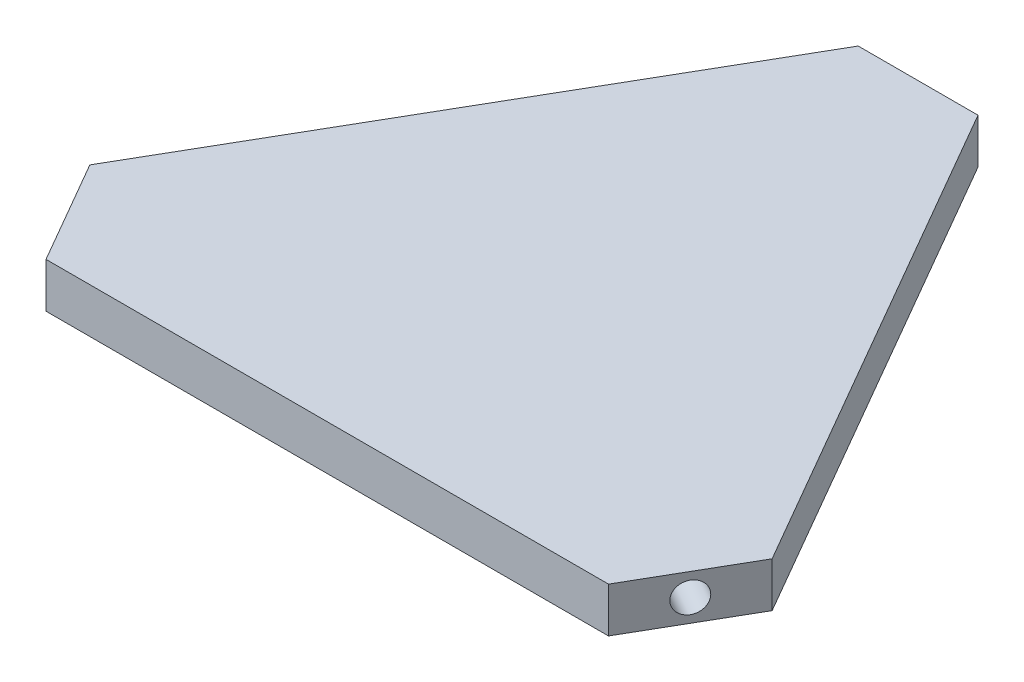
ISO-10303-21;
HEADER;
FILE_DESCRIPTION(('STEP AP214'),'2;1');
FILE_NAME('part.step','',(''),(''),'','','');
FILE_SCHEMA(('AUTOMOTIVE_DESIGN { 1 0 10303 214 1 1 1 1 }'));
ENDSEC;
DATA;
#1=APPLICATION_CONTEXT('core data for automotive mechanical design processes');
#2=APPLICATION_PROTOCOL_DEFINITION('international standard','automotive_design',2000,#1);
#3=PRODUCT_CONTEXT('',#1,'mechanical');
#4=PRODUCT('Part','Part','',(#3));
#5=PRODUCT_RELATED_PRODUCT_CATEGORY('part','',(#4));
#6=PRODUCT_DEFINITION_FORMATION('','',#4);
#7=PRODUCT_DEFINITION_CONTEXT('part definition',#1,'design');
#8=PRODUCT_DEFINITION('design','',#6,#7);
#9=PRODUCT_DEFINITION_SHAPE('','',#8);
#10=(LENGTH_UNIT() NAMED_UNIT(*) SI_UNIT(.MILLI.,.METRE.));
#11=(NAMED_UNIT(*) PLANE_ANGLE_UNIT() SI_UNIT($,.RADIAN.));
#12=(NAMED_UNIT(*) SI_UNIT($,.STERADIAN.) SOLID_ANGLE_UNIT());
#13=UNCERTAINTY_MEASURE_WITH_UNIT(LENGTH_MEASURE(1.E-05),#10,'distance_accuracy_value','');
#14=(GEOMETRIC_REPRESENTATION_CONTEXT(3) GLOBAL_UNCERTAINTY_ASSIGNED_CONTEXT((#13)) GLOBAL_UNIT_ASSIGNED_CONTEXT((#10,
#11,#12)) REPRESENTATION_CONTEXT('',''));
#15=CARTESIAN_POINT('',(0.,0.,0.));
#16=DIRECTION('',(0.,0.,1.));
#17=DIRECTION('',(1.,0.,0.));
#18=AXIS2_PLACEMENT_3D('',#15,#16,#17);
#19=CARTESIAN_POINT('',(72.3411357683743,4.7625,27.1014773719377));
#20=DIRECTION('',(-0.866025403784439,0.,0.5));
#21=DIRECTION('',(0.5,0.,0.866025403784439));
#22=AXIS2_PLACEMENT_3D('',#19,#20,#21);
#23=PLANE('',#22);
#24=DIRECTION('',(-0.5,0.,-0.866025403784439));
#25=VECTOR('',#24,1.);
#26=CARTESIAN_POINT('',(72.3411357683743,-4.7625,27.1014773719377));
#27=LINE('',#26,#25);
#28=CARTESIAN_POINT('',(72.3411357683743,-4.7625,27.1014773719377));
#29=VERTEX_POINT('',#28);
#30=CARTESIAN_POINT('',(12.7,-4.7625,-76.2));
#31=VERTEX_POINT('',#30);
#32=EDGE_CURVE('E122',#29,#31,#27,.T.);
#33=ORIENTED_EDGE('',*,*,#32,.T.);
#34=DIRECTION('',(0.,-1.,0.));
#35=VECTOR('',#34,1.);
#36=CARTESIAN_POINT('',(12.7,4.7625,-76.2));
#37=LINE('',#36,#35);
#38=CARTESIAN_POINT('',(12.7,4.7625,-76.2));
#39=VERTEX_POINT('',#38);
#40=EDGE_CURVE('E11',#39,#31,#37,.T.);
#41=ORIENTED_EDGE('',*,*,#40,.F.);
#42=DIRECTION('',(-0.5,0.,-0.866025403784439));
#43=VECTOR('',#42,1.);
#44=CARTESIAN_POINT('',(72.3411357683743,4.7625,27.1014773719377));
#45=LINE('',#44,#43);
#46=CARTESIAN_POINT('',(72.3411357683743,4.7625,27.1014773719377));
#47=VERTEX_POINT('',#46);
#48=EDGE_CURVE('E133',#47,#39,#45,.T.);
#49=ORIENTED_EDGE('',*,*,#48,.F.);
#50=DIRECTION('',(0.,-1.,0.));
#51=VECTOR('',#50,1.);
#52=CARTESIAN_POINT('',(72.3411357683743,4.7625,27.1014773719377));
#53=LINE('',#52,#51);
#54=EDGE_CURVE('E118',#47,#29,#53,.T.);
#55=ORIENTED_EDGE('',*,*,#54,.T.);
#56=EDGE_LOOP('',(#33,#41,#49,#55));
#57=FACE_BOUND('',#56,.T.);
#58=ADVANCED_FACE('F35',(#57),#23,.F.);
#59=CARTESIAN_POINT('',(12.7,4.7625,-76.2));
#60=DIRECTION('',(0.,0.,1.));
#61=DIRECTION('',(1.,0.,0.));
#62=AXIS2_PLACEMENT_3D('',#59,#60,#61);
#63=PLANE('',#62);
#64=CARTESIAN_POINT('',(-2.70616862252382E-13,0.,-76.2000000000001));
#65=DIRECTION('',(0.,0.,-1.));
#66=DIRECTION('',(-1.,0.,0.));
#67=AXIS2_PLACEMENT_3D('',#64,#65,#66);
#68=CIRCLE('',#67,3.17499999999999);
#69=CARTESIAN_POINT('',(-3.17500000000026,0.,-76.2000000000001));
#70=VERTEX_POINT('',#69);
#71=EDGE_CURVE('E181',#70,#70,#68,.T.);
#72=ORIENTED_EDGE('',*,*,#71,.F.);
#73=EDGE_LOOP('',(#72));
#74=FACE_BOUND('',#73,.T.);
#75=DIRECTION('',(-1.,0.,0.));
#76=VECTOR('',#75,1.);
#77=CARTESIAN_POINT('',(12.7,-4.7625,-76.2));
#78=LINE('',#77,#76);
#79=CARTESIAN_POINT('',(-12.7,-4.7625,-76.2));
#80=VERTEX_POINT('',#79);
#81=EDGE_CURVE('E125',#31,#80,#78,.T.);
#82=ORIENTED_EDGE('',*,*,#81,.T.);
#83=DIRECTION('',(0.,-1.,0.));
#84=VECTOR('',#83,1.);
#85=CARTESIAN_POINT('',(-12.7,4.7625,-76.2));
#86=LINE('',#85,#84);
#87=CARTESIAN_POINT('',(-12.7,4.7625,-76.2));
#88=VERTEX_POINT('',#87);
#89=EDGE_CURVE('E43',#88,#80,#86,.T.);
#90=ORIENTED_EDGE('',*,*,#89,.F.);
#91=DIRECTION('',(-1.,0.,0.));
#92=VECTOR('',#91,1.);
#93=CARTESIAN_POINT('',(12.7,4.7625,-76.2));
#94=LINE('',#93,#92);
#95=EDGE_CURVE('E89',#39,#88,#94,.T.);
#96=ORIENTED_EDGE('',*,*,#95,.F.);
#97=ORIENTED_EDGE('',*,*,#40,.T.);
#98=EDGE_LOOP('',(#82,#90,#96,#97));
#99=FACE_BOUND('',#98,.T.);
#100=ADVANCED_FACE('F159',(#74,#99),#63,.F.);
#101=CARTESIAN_POINT('',(-12.7,4.7625,-76.2));
#102=DIRECTION('',(0.866025403784439,0.,0.5));
#103=DIRECTION('',(0.5,0.,-0.866025403784439));
#104=AXIS2_PLACEMENT_3D('',#101,#102,#103);
#105=PLANE('',#104);
#106=DIRECTION('',(-0.5,0.,0.866025403784439));
#107=VECTOR('',#106,1.);
#108=CARTESIAN_POINT('',(-12.7,-4.7625,-76.2));
#109=LINE('',#108,#107);
#110=CARTESIAN_POINT('',(-72.3411357683742,-4.7625,27.1014773719376));
#111=VERTEX_POINT('',#110);
#112=EDGE_CURVE('E128',#80,#111,#109,.T.);
#113=ORIENTED_EDGE('',*,*,#112,.T.);
#114=DIRECTION('',(0.,-1.,0.));
#115=VECTOR('',#114,1.);
#116=CARTESIAN_POINT('',(-72.3411357683742,4.7625,27.1014773719376));
#117=LINE('',#116,#115);
#118=CARTESIAN_POINT('',(-72.3411357683742,4.7625,27.1014773719376));
#119=VERTEX_POINT('',#118);
#120=EDGE_CURVE('E113',#119,#111,#117,.T.);
#121=ORIENTED_EDGE('',*,*,#120,.F.);
#122=DIRECTION('',(-0.5,0.,0.866025403784439));
#123=VECTOR('',#122,1.);
#124=CARTESIAN_POINT('',(-12.7,4.7625,-76.2));
#125=LINE('',#124,#123);
#126=EDGE_CURVE('E104',#88,#119,#125,.T.);
#127=ORIENTED_EDGE('',*,*,#126,.F.);
#128=ORIENTED_EDGE('',*,*,#89,.T.);
#129=EDGE_LOOP('',(#113,#121,#127,#128));
#130=FACE_BOUND('',#129,.T.);
#131=ADVANCED_FACE('F139',(#130),#105,.F.);
#132=CARTESIAN_POINT('',(-72.3411357683742,4.7625,27.1014773719376));
#133=DIRECTION('',(0.866025403784438,0.,-0.5));
#134=DIRECTION('',(-0.5,0.,-0.866025403784438));
#135=AXIS2_PLACEMENT_3D('',#132,#133,#134);
#136=PLANE('',#135);
#137=CARTESIAN_POINT('',(-65.991135768374,0.,38.1000000000006));
#138=DIRECTION('',(-0.866025403784434,0.,0.500000000000007));
#139=DIRECTION('',(0.500000000000007,0.,0.866025403784435));
#140=AXIS2_PLACEMENT_3D('',#137,#138,#139);
#141=CIRCLE('',#140,3.17499999999999);
#142=CARTESIAN_POINT('',(-64.403635768374,0.,40.8496306570162));
#143=VERTEX_POINT('',#142);
#144=EDGE_CURVE('E176',#143,#143,#141,.T.);
#145=ORIENTED_EDGE('',*,*,#144,.F.);
#146=EDGE_LOOP('',(#145));
#147=FACE_BOUND('',#146,.T.);
#148=DIRECTION('',(0.5,0.,0.866025403784438));
#149=VECTOR('',#148,1.);
#150=CARTESIAN_POINT('',(-72.3411357683742,-4.7625,27.1014773719376));
#151=LINE('',#150,#149);
#152=CARTESIAN_POINT('',(-59.6411357683742,-4.7625,49.0985226280624));
#153=VERTEX_POINT('',#152);
#154=EDGE_CURVE('E112',#111,#153,#151,.T.);
#155=ORIENTED_EDGE('',*,*,#154,.T.);
#156=DIRECTION('',(0.,-1.,0.));
#157=VECTOR('',#156,1.);
#158=CARTESIAN_POINT('',(-59.6411357683742,4.7625,49.0985226280624));
#159=LINE('',#158,#157);
#160=CARTESIAN_POINT('',(-59.6411357683742,4.7625,49.0985226280624));
#161=VERTEX_POINT('',#160);
#162=EDGE_CURVE('E109',#161,#153,#159,.T.);
#163=ORIENTED_EDGE('',*,*,#162,.F.);
#164=DIRECTION('',(0.5,0.,0.866025403784438));
#165=VECTOR('',#164,1.);
#166=CARTESIAN_POINT('',(-72.3411357683742,4.7625,27.1014773719376));
#167=LINE('',#166,#165);
#168=EDGE_CURVE('E98',#119,#161,#167,.T.);
#169=ORIENTED_EDGE('',*,*,#168,.F.);
#170=ORIENTED_EDGE('',*,*,#120,.T.);
#171=EDGE_LOOP('',(#155,#163,#169,#170));
#172=FACE_BOUND('',#171,.T.);
#173=ADVANCED_FACE('F110',(#147,#172),#136,.F.);
#174=CARTESIAN_POINT('',(-59.6411357683742,4.7625,49.0985226280624));
#175=DIRECTION('',(0.,0.,-1.));
#176=DIRECTION('',(-1.,0.,0.));
#177=AXIS2_PLACEMENT_3D('',#174,#175,#176);
#178=PLANE('',#177);
#179=DIRECTION('',(1.,0.,0.));
#180=VECTOR('',#179,1.);
#181=CARTESIAN_POINT('',(-59.6411357683742,-4.7625,49.0985226280624));
#182=LINE('',#181,#180);
#183=CARTESIAN_POINT('',(59.6411357683742,-4.7625,49.0985226280624));
#184=VERTEX_POINT('',#183);
#185=EDGE_CURVE('E75',#153,#184,#182,.T.);
#186=ORIENTED_EDGE('',*,*,#185,.T.);
#187=DIRECTION('',(0.,-1.,0.));
#188=VECTOR('',#187,1.);
#189=CARTESIAN_POINT('',(59.6411357683742,4.7625,49.0985226280624));
#190=LINE('',#189,#188);
#191=CARTESIAN_POINT('',(59.6411357683742,4.7625,49.0985226280624));
#192=VERTEX_POINT('',#191);
#193=EDGE_CURVE('E114',#192,#184,#190,.T.);
#194=ORIENTED_EDGE('',*,*,#193,.F.);
#195=DIRECTION('',(1.,0.,0.));
#196=VECTOR('',#195,1.);
#197=CARTESIAN_POINT('',(-59.6411357683742,4.7625,49.0985226280624));
#198=LINE('',#197,#196);
#199=EDGE_CURVE('E102',#161,#192,#198,.T.);
#200=ORIENTED_EDGE('',*,*,#199,.F.);
#201=ORIENTED_EDGE('',*,*,#162,.T.);
#202=EDGE_LOOP('',(#186,#194,#200,#201));
#203=FACE_BOUND('',#202,.T.);
#204=ADVANCED_FACE('F116',(#203),#178,.F.);
#205=CARTESIAN_POINT('',(72.3411357683743,4.7625,27.1014773719377));
#206=DIRECTION('',(-0.866025403784438,0.,-0.500000000000001));
#207=DIRECTION('',(-0.500000000000001,0.,0.866025403784438));
#208=AXIS2_PLACEMENT_3D('',#205,#206,#207);
#209=PLANE('',#208);
#210=CARTESIAN_POINT('',(65.9911357683743,0.,38.1000000000001));
#211=DIRECTION('',(0.866025403784438,0.,0.500000000000001));
#212=DIRECTION('',(0.500000000000001,0.,-0.866025403784438));
#213=AXIS2_PLACEMENT_3D('',#210,#211,#212);
#214=CIRCLE('',#213,3.17499999999999);
#215=CARTESIAN_POINT('',(67.5786357683743,0.,35.3503693429845));
#216=VERTEX_POINT('',#215);
#217=EDGE_CURVE('E189',#216,#216,#214,.T.);
#218=ORIENTED_EDGE('',*,*,#217,.F.);
#219=EDGE_LOOP('',(#218));
#220=FACE_BOUND('',#219,.T.);
#221=DIRECTION('',(0.500000000000001,0.,-0.866025403784438));
#222=VECTOR('',#221,1.);
#223=CARTESIAN_POINT('',(72.3411357683743,-4.7625,27.1014773719377));
#224=LINE('',#223,#222);
#225=EDGE_CURVE('E81',#184,#29,#224,.T.);
#226=ORIENTED_EDGE('',*,*,#225,.T.);
#227=ORIENTED_EDGE('',*,*,#54,.F.);
#228=DIRECTION('',(0.500000000000001,0.,-0.866025403784438));
#229=VECTOR('',#228,1.);
#230=CARTESIAN_POINT('',(72.3411357683743,4.7625,27.1014773719377));
#231=LINE('',#230,#229);
#232=EDGE_CURVE('E51',#192,#47,#231,.T.);
#233=ORIENTED_EDGE('',*,*,#232,.F.);
#234=ORIENTED_EDGE('',*,*,#193,.T.);
#235=EDGE_LOOP('',(#226,#227,#233,#234));
#236=FACE_BOUND('',#235,.T.);
#237=ADVANCED_FACE('F146',(#220,#236),#209,.F.);
#238=CARTESIAN_POINT('',(0.,4.7625,0.));
#239=DIRECTION('',(0.,1.,0.));
#240=DIRECTION('',(0.,0.,1.));
#241=AXIS2_PLACEMENT_3D('',#238,#239,#240);
#242=PLANE('',#241);
#243=ORIENTED_EDGE('',*,*,#48,.T.);
#244=ORIENTED_EDGE('',*,*,#95,.T.);
#245=ORIENTED_EDGE('',*,*,#126,.T.);
#246=ORIENTED_EDGE('',*,*,#168,.T.);
#247=ORIENTED_EDGE('',*,*,#199,.T.);
#248=ORIENTED_EDGE('',*,*,#232,.T.);
#249=EDGE_LOOP('',(#243,#244,#245,#246,#247,#248));
#250=FACE_BOUND('',#249,.T.);
#251=ADVANCED_FACE('F100',(#250),#242,.T.);
#252=CARTESIAN_POINT('',(0.,-4.7625,0.));
#253=DIRECTION('',(0.,1.,0.));
#254=DIRECTION('',(0.,0.,1.));
#255=AXIS2_PLACEMENT_3D('',#252,#253,#254);
#256=PLANE('',#255);
#257=ORIENTED_EDGE('',*,*,#32,.F.);
#258=ORIENTED_EDGE('',*,*,#225,.F.);
#259=ORIENTED_EDGE('',*,*,#185,.F.);
#260=ORIENTED_EDGE('',*,*,#154,.F.);
#261=ORIENTED_EDGE('',*,*,#112,.F.);
#262=ORIENTED_EDGE('',*,*,#81,.F.);
#263=EDGE_LOOP('',(#257,#258,#259,#260,#261,#262));
#264=FACE_BOUND('',#263,.T.);
#265=ADVANCED_FACE('F142',(#264),#256,.F.);
#266=CARTESIAN_POINT('',(54.9926131403119,0.,31.7500000000001));
#267=DIRECTION('',(0.866025403784438,0.,0.500000000000001));
#268=DIRECTION('',(0.500000000000001,0.,-0.866025403784438));
#269=AXIS2_PLACEMENT_3D('',#266,#267,#268);
#270=CONICAL_SURFACE('',#269,3.17499999999999,1.02974425867665);
#271=CARTESIAN_POINT('',(53.3404683616404,0.,30.7961337672938));
#272=VERTEX_POINT('',#271);
#273=VERTEX_LOOP('',#272);
#274=FACE_BOUND('',#273,.T.);
#275=CARTESIAN_POINT('',(54.9926131403119,0.,31.7500000000001));
#276=DIRECTION('',(0.866025403784438,0.,0.500000000000001));
#277=DIRECTION('',(0.500000000000001,0.,-0.866025403784438));
#278=AXIS2_PLACEMENT_3D('',#275,#276,#277);
#279=CIRCLE('',#278,3.17499999999999);
#280=CARTESIAN_POINT('',(56.5801131403119,0.,29.0003693429845));
#281=VERTEX_POINT('',#280);
#282=EDGE_CURVE('E126',#281,#281,#279,.T.);
#283=ORIENTED_EDGE('',*,*,#282,.T.);
#284=EDGE_LOOP('',(#283));
#285=FACE_BOUND('',#284,.T.);
#286=ADVANCED_FACE('F197',(#274,#285),#270,.F.);
#287=CARTESIAN_POINT('',(65.9911357683743,0.,38.1000000000001));
#288=DIRECTION('',(0.866025403784438,0.,0.500000000000001));
#289=DIRECTION('',(0.500000000000001,0.,-0.866025403784438));
#290=AXIS2_PLACEMENT_3D('',#287,#288,#289);
#291=CYLINDRICAL_SURFACE('',#290,3.17499999999999);
#292=CARTESIAN_POINT('',(56.5801131403119,0.,29.0003693429845));
#293=CARTESIAN_POINT('',(56.6946810843542,0.,29.0665151763178));
#294=CARTESIAN_POINT('',(56.8092490283965,0.,29.1326610096512));
#295=CARTESIAN_POINT('',(57.0383849164811,0.,29.2649526763179));
#296=CARTESIAN_POINT('',(57.1529528605235,0.,29.3310985096512));
#297=CARTESIAN_POINT('',(57.3820887486081,0.,29.4633901763179));
#298=CARTESIAN_POINT('',(57.4966566926504,0.,29.5295360096512));
#299=CARTESIAN_POINT('',(57.725792580735,0.,29.6618276763179));
#300=CARTESIAN_POINT('',(57.8403605247774,0.,29.7279735096512));
#301=CARTESIAN_POINT('',(58.069496412862,0.,29.8602651763179));
#302=CARTESIAN_POINT('',(58.1840643569043,0.,29.9264110096512));
#303=CARTESIAN_POINT('',(58.4132002449889,0.,30.0587026763179));
#304=CARTESIAN_POINT('',(58.5277681890313,0.,30.1248485096512));
#305=CARTESIAN_POINT('',(58.7569040771159,0.,30.2571401763179));
#306=CARTESIAN_POINT('',(58.8714720211582,0.,30.3232860096512));
#307=CARTESIAN_POINT('',(59.1006079092428,0.,30.4555776763179));
#308=CARTESIAN_POINT('',(59.2151758532852,0.,30.5217235096512));
#309=CARTESIAN_POINT('',(59.4443117413698,0.,30.6540151763179));
#310=CARTESIAN_POINT('',(59.5588796854121,0.,30.7201610096512));
#311=CARTESIAN_POINT('',(59.7880155734967,0.,30.8524526763179));
#312=CARTESIAN_POINT('',(59.9025835175391,0.,30.9185985096512));
#313=CARTESIAN_POINT('',(60.1317194056237,0.,31.0508901763179));
#314=CARTESIAN_POINT('',(60.246287349666,0.,31.1170360096512));
#315=CARTESIAN_POINT('',(60.4754232377506,0.,31.2493276763179));
#316=CARTESIAN_POINT('',(60.589991181793,0.,31.3154735096512));
#317=CARTESIAN_POINT('',(60.8191270698776,0.,31.4477651763179));
#318=CARTESIAN_POINT('',(60.9336950139199,0.,31.5139110096512));
#319=CARTESIAN_POINT('',(61.1628309020045,0.,31.6462026763179));
#320=CARTESIAN_POINT('',(61.2773988460469,0.,31.7123485096512));
#321=CARTESIAN_POINT('',(61.5065347341315,0.,31.8446401763178));
#322=CARTESIAN_POINT('',(61.6211026781738,0.,31.9107860096512));
#323=CARTESIAN_POINT('',(61.8502385662584,0.,32.0430776763179));
#324=CARTESIAN_POINT('',(61.9648065103008,0.,32.1092235096512));
#325=CARTESIAN_POINT('',(62.1939423983854,0.,32.2415151763179));
#326=CARTESIAN_POINT('',(62.3085103424277,0.,32.3076610096512));
#327=CARTESIAN_POINT('',(62.5376462305123,0.,32.4399526763179));
#328=CARTESIAN_POINT('',(62.6522141745547,0.,32.5060985096512));
#329=CARTESIAN_POINT('',(62.8813500626393,0.,32.6383901763179));
#330=CARTESIAN_POINT('',(62.9959180066816,0.,32.7045360096512));
#331=CARTESIAN_POINT('',(63.2250538947662,0.,32.8368276763179));
#332=CARTESIAN_POINT('',(63.3396218388085,0.,32.9029735096512));
#333=CARTESIAN_POINT('',(63.5687577268932,0.,33.0352651763179));
#334=CARTESIAN_POINT('',(63.6833256709355,0.,33.1014110096512));
#335=CARTESIAN_POINT('',(63.9124615590201,0.,33.2337026763179));
#336=CARTESIAN_POINT('',(64.0270295030625,0.,33.2998485096512));
#337=CARTESIAN_POINT('',(64.2561653911471,0.,33.4321401763179));
#338=CARTESIAN_POINT('',(64.3707333351894,0.,33.4982860096512));
#339=CARTESIAN_POINT('',(64.599869223274,0.,33.6305776763179));
#340=CARTESIAN_POINT('',(64.7144371673164,0.,33.6967235096512));
#341=CARTESIAN_POINT('',(64.943573055401,0.,33.8290151763179));
#342=CARTESIAN_POINT('',(65.0581409994433,0.,33.8951610096512));
#343=CARTESIAN_POINT('',(65.2872768875279,0.,34.0274526763179));
#344=CARTESIAN_POINT('',(65.4018448315703,0.,34.0935985096512));
#345=CARTESIAN_POINT('',(65.6309807196549,0.,34.2258901763179));
#346=CARTESIAN_POINT('',(65.7455486636972,0.,34.2920360096512));
#347=CARTESIAN_POINT('',(65.9746845517818,0.,34.4243276763179));
#348=CARTESIAN_POINT('',(66.0892524958241,0.,34.4904735096512));
#349=CARTESIAN_POINT('',(66.3183883839088,0.,34.6227651763179));
#350=CARTESIAN_POINT('',(66.4329563279511,0.,34.6889110096512));
#351=CARTESIAN_POINT('',(66.6620922160357,0.,34.8212026763179));
#352=CARTESIAN_POINT('',(66.7766601600781,0.,34.8873485096512));
#353=CARTESIAN_POINT('',(67.0057960481627,0.,35.0196401763179));
#354=CARTESIAN_POINT('',(67.120363992205,0.,35.0857860096512));
#355=CARTESIAN_POINT('',(67.3494998802896,0.,35.2180776763179));
#356=CARTESIAN_POINT('',(67.4640678243319,0.,35.2842235096512));
#357=CARTESIAN_POINT('',(67.5786357683743,0.,35.3503693429845));
#358=B_SPLINE_CURVE_WITH_KNOTS('',3,(#292,#293,#294,#295,#296,#297,#298,#299,#300,#301,#302,
#303,#304,#305,#306,#307,#308,#309,#310,#311,#312,#313,#314,#315,#316,#317,#318,#319,#320,#321,
#322,#323,#324,#325,#326,#327,#328,#329,#330,#331,#332,#333,#334,#335,#336,#337,#338,#339,#340,
#341,#342,#343,#344,#345,#346,#347,#348,#349,#350,#351,#352,#353,#354,#355,#356,#357),
.UNSPECIFIED.,.F.,.F.,(4,2,2,2,2,2,2,2,2,2,2,2,2,2,2,2,2,2,2,2,2,2,2,2,2,2,2,2,2,2,2,2,4),(0.,
0.396874999999995,0.793749999999999,1.19062499999999,1.5875,1.984375,2.38125,2.778125,3.175,
3.571875,3.96875,4.365625,4.7625,5.159375,5.55625,5.953125,6.35,6.746875,7.14375000000001,
7.540625,7.9375,8.334375,8.73125,9.128125,9.52500000000001,9.92187500000001,10.31875,10.715625,
11.1125,11.509375,11.90625,12.303125,12.7),.UNSPECIFIED.);
#359=EDGE_CURVE('BSEAM199',#281,#216,#358,.T.);
#360=ORIENTED_EDGE('',*,*,#282,.F.);
#361=ORIENTED_EDGE('',*,*,#217,.T.);
#362=ORIENTED_EDGE('',*,*,#359,.T.);
#363=ORIENTED_EDGE('',*,*,#359,.F.);
#364=EDGE_LOOP('',(#360,#362,#361,#363));
#365=FACE_BOUND('',#364,.T.);
#366=ADVANCED_FACE('F199',(#365),#291,.F.);
#367=CARTESIAN_POINT('',(-2.70616862252382E-13,0.,-63.5000000000001));
#368=DIRECTION('',(0.,0.,-1.));
#369=DIRECTION('',(-1.,0.,0.));
#370=AXIS2_PLACEMENT_3D('',#367,#368,#369);
#371=CONICAL_SURFACE('',#370,3.17499999999999,1.02974425867665);
#372=CARTESIAN_POINT('',(-2.75481445719414E-13,0.,-61.5922675345876));
#373=VERTEX_POINT('',#372);
#374=VERTEX_LOOP('',#373);
#375=FACE_BOUND('',#374,.T.);
#376=CARTESIAN_POINT('',(-2.70616862252382E-13,0.,-63.5000000000001));
#377=DIRECTION('',(0.,0.,-1.));
#378=DIRECTION('',(-1.,0.,0.));
#379=AXIS2_PLACEMENT_3D('',#376,#377,#378);
#380=CIRCLE('',#379,3.17499999999999);
#381=CARTESIAN_POINT('',(-3.17500000000026,0.,-63.5000000000001));
#382=VERTEX_POINT('',#381);
#383=EDGE_CURVE('E186',#382,#382,#380,.T.);
#384=ORIENTED_EDGE('',*,*,#383,.T.);
#385=EDGE_LOOP('',(#384));
#386=FACE_BOUND('',#385,.T.);
#387=ADVANCED_FACE('F202',(#375,#386),#371,.F.);
#388=CARTESIAN_POINT('',(-2.70616862252382E-13,0.,-76.2000000000001));
#389=DIRECTION('',(0.,0.,-1.));
#390=DIRECTION('',(-1.,0.,0.));
#391=AXIS2_PLACEMENT_3D('',#388,#389,#390);
#392=CYLINDRICAL_SURFACE('',#391,3.17499999999999);
#393=ORIENTED_EDGE('',*,*,#383,.F.);
#394=EDGE_LOOP('',(#393));
#395=FACE_BOUND('',#394,.T.);
#396=ORIENTED_EDGE('',*,*,#71,.T.);
#397=EDGE_LOOP('',(#396));
#398=FACE_BOUND('',#397,.T.);
#399=ADVANCED_FACE('F208',(#395,#398),#392,.F.);
#400=CARTESIAN_POINT('',(-54.9926131403117,0.,31.7500000000005));
#401=DIRECTION('',(-0.866025403784434,0.,0.500000000000007));
#402=DIRECTION('',(0.500000000000007,0.,0.866025403784435));
#403=AXIS2_PLACEMENT_3D('',#400,#401,#402);
#404=CONICAL_SURFACE('',#403,3.17499999999999,1.02974425867665);
#405=CARTESIAN_POINT('',(-53.3404683616401,0.,30.7961337672942));
#406=VERTEX_POINT('',#405);
#407=VERTEX_LOOP('',#406);
#408=FACE_BOUND('',#407,.T.);
#409=CARTESIAN_POINT('',(-54.9926131403117,0.,31.7500000000005));
#410=DIRECTION('',(-0.866025403784434,0.,0.500000000000007));
#411=DIRECTION('',(0.500000000000007,0.,0.866025403784435));
#412=AXIS2_PLACEMENT_3D('',#409,#410,#411);
#413=CIRCLE('',#412,3.17499999999999);
#414=CARTESIAN_POINT('',(-53.4051131403116,0.,34.4996306570161));
#415=VERTEX_POINT('',#414);
#416=EDGE_CURVE('E178',#415,#415,#413,.T.);
#417=ORIENTED_EDGE('',*,*,#416,.T.);
#418=EDGE_LOOP('',(#417));
#419=FACE_BOUND('',#418,.T.);
#420=ADVANCED_FACE('F255',(#408,#419),#404,.F.);
#421=CARTESIAN_POINT('',(-65.991135768374,0.,38.1000000000006));
#422=DIRECTION('',(-0.866025403784434,0.,0.500000000000007));
#423=DIRECTION('',(0.500000000000007,0.,0.866025403784435));
#424=AXIS2_PLACEMENT_3D('',#421,#422,#423);
#425=CYLINDRICAL_SURFACE('',#424,3.17499999999999);
#426=CARTESIAN_POINT('',(-53.4051131403116,0.,34.4996306570161));
#427=CARTESIAN_POINT('',(-53.519681084354,0.,34.5657764903494));
#428=CARTESIAN_POINT('',(-53.6342490283963,0.,34.6319223236827));
#429=CARTESIAN_POINT('',(-53.8633849164809,0.,34.7642139903494));
#430=CARTESIAN_POINT('',(-53.9779528605232,0.,34.8303598236827));
#431=CARTESIAN_POINT('',(-54.2070887486079,0.,34.9626514903494));
#432=CARTESIAN_POINT('',(-54.3216566926502,0.,35.0287973236827));
#433=CARTESIAN_POINT('',(-54.5507925807348,0.,35.1610889903494));
#434=CARTESIAN_POINT('',(-54.6653605247771,0.,35.2272348236827));
#435=CARTESIAN_POINT('',(-54.8944964128618,0.,35.3595264903494));
#436=CARTESIAN_POINT('',(-55.0090643569041,0.,35.4256723236827));
#437=CARTESIAN_POINT('',(-55.2382002449887,0.,35.5579639903494));
#438=CARTESIAN_POINT('',(-55.352768189031,0.,35.6241098236827));
#439=CARTESIAN_POINT('',(-55.5819040771156,0.,35.7564014903494));
#440=CARTESIAN_POINT('',(-55.696472021158,0.,35.8225473236827));
#441=CARTESIAN_POINT('',(-55.9256079092426,0.,35.9548389903494));
#442=CARTESIAN_POINT('',(-56.0401758532849,0.,36.0209848236827));
#443=CARTESIAN_POINT('',(-56.2693117413695,0.,36.1532764903494));
#444=CARTESIAN_POINT('',(-56.3838796854119,0.,36.2194223236827));
#445=CARTESIAN_POINT('',(-56.6130155734965,0.,36.3517139903494));
#446=CARTESIAN_POINT('',(-56.7275835175388,0.,36.4178598236828));
#447=CARTESIAN_POINT('',(-56.9567194056234,0.,36.5501514903494));
#448=CARTESIAN_POINT('',(-57.0712873496658,0.,36.6162973236828));
#449=CARTESIAN_POINT('',(-57.3004232377504,0.,36.7485889903494));
#450=CARTESIAN_POINT('',(-57.4149911817927,0.,36.8147348236828));
#451=CARTESIAN_POINT('',(-57.6441270698773,0.,36.9470264903494));
#452=CARTESIAN_POINT('',(-57.7586950139196,0.,37.0131723236828));
#453=CARTESIAN_POINT('',(-57.9878309020043,0.,37.1454639903494));
#454=CARTESIAN_POINT('',(-58.1023988460466,0.,37.2116098236828));
#455=CARTESIAN_POINT('',(-58.3315347341312,0.,37.3439014903494));
#456=CARTESIAN_POINT('',(-58.4461026781735,0.,37.4100473236828));
#457=CARTESIAN_POINT('',(-58.6752385662582,0.,37.5423389903494));
#458=CARTESIAN_POINT('',(-58.7898065103005,0.,37.6084848236828));
#459=CARTESIAN_POINT('',(-59.0189423983851,0.,37.7407764903494));
#460=CARTESIAN_POINT('',(-59.1335103424274,0.,37.8069223236828));
#461=CARTESIAN_POINT('',(-59.3626462305121,0.,37.9392139903494));
#462=CARTESIAN_POINT('',(-59.4772141745544,0.,38.0053598236828));
#463=CARTESIAN_POINT('',(-59.706350062639,0.,38.1376514903494));
#464=CARTESIAN_POINT('',(-59.8209180066813,0.,38.2037973236828));
#465=CARTESIAN_POINT('',(-60.050053894766,0.,38.3360889903495));
#466=CARTESIAN_POINT('',(-60.1646218388083,0.,38.4022348236828));
#467=CARTESIAN_POINT('',(-60.3937577268929,0.,38.5345264903495));
#468=CARTESIAN_POINT('',(-60.5083256709352,0.,38.6006723236828));
#469=CARTESIAN_POINT('',(-60.7374615590199,0.,38.7329639903495));
#470=CARTESIAN_POINT('',(-60.8520295030622,0.,38.7991098236828));
#471=CARTESIAN_POINT('',(-61.0811653911468,0.,38.9314014903495));
#472=CARTESIAN_POINT('',(-61.1957333351891,0.,38.9975473236828));
#473=CARTESIAN_POINT('',(-61.4248692232738,0.,39.1298389903495));
#474=CARTESIAN_POINT('',(-61.5394371673161,0.,39.1959848236828));
#475=CARTESIAN_POINT('',(-61.7685730554007,0.,39.3282764903495));
#476=CARTESIAN_POINT('',(-61.883140999443,0.,39.3944223236828));
#477=CARTESIAN_POINT('',(-62.1122768875276,0.,39.5267139903495));
#478=CARTESIAN_POINT('',(-62.22684483157,0.,39.5928598236828));
#479=CARTESIAN_POINT('',(-62.4559807196546,0.,39.7251514903495));
#480=CARTESIAN_POINT('',(-62.5705486636969,0.,39.7912973236828));
#481=CARTESIAN_POINT('',(-62.7996845517815,0.,39.9235889903495));
#482=CARTESIAN_POINT('',(-62.9142524958239,0.,39.9897348236828));
#483=CARTESIAN_POINT('',(-63.1433883839085,0.,40.1220264903495));
#484=CARTESIAN_POINT('',(-63.2579563279508,0.,40.1881723236828));
#485=CARTESIAN_POINT('',(-63.4870922160354,0.,40.3204639903495));
#486=CARTESIAN_POINT('',(-63.6016601600778,0.,40.3866098236828));
#487=CARTESIAN_POINT('',(-63.8307960481624,0.,40.5189014903495));
#488=CARTESIAN_POINT('',(-63.9453639922047,0.,40.5850473236828));
#489=CARTESIAN_POINT('',(-64.1744998802893,0.,40.7173389903495));
#490=CARTESIAN_POINT('',(-64.2890678243317,0.,40.7834848236828));
#491=CARTESIAN_POINT('',(-64.403635768374,0.,40.8496306570162));
#492=B_SPLINE_CURVE_WITH_KNOTS('',3,(#426,#427,#428,#429,#430,#431,#432,#433,#434,#435,#436,
#437,#438,#439,#440,#441,#442,#443,#444,#445,#446,#447,#448,#449,#450,#451,#452,#453,#454,#455,
#456,#457,#458,#459,#460,#461,#462,#463,#464,#465,#466,#467,#468,#469,#470,#471,#472,#473,#474,
#475,#476,#477,#478,#479,#480,#481,#482,#483,#484,#485,#486,#487,#488,#489,#490,#491),
.UNSPECIFIED.,.F.,.F.,(4,2,2,2,2,2,2,2,2,2,2,2,2,2,2,2,2,2,2,2,2,2,2,2,2,2,2,2,2,2,2,2,4),(0.,
0.396875000000003,0.793750000000007,1.19062500000001,1.5875,1.98437500000001,2.38125,2.778125,
3.17500000000001,3.57187500000001,3.96875000000001,4.365625,4.76250000000001,5.159375,
5.55625000000001,5.953125,6.35000000000001,6.746875,7.14375,7.54062500000001,7.9375,
8.33437500000001,8.73125,9.12812500000001,9.52500000000001,9.92187500000001,10.31875,10.715625,
11.1125,11.509375,11.90625,12.303125,12.7),.UNSPECIFIED.);
#493=EDGE_CURVE('BSEAM264',#415,#143,#492,.T.);
#494=ORIENTED_EDGE('',*,*,#416,.F.);
#495=ORIENTED_EDGE('',*,*,#144,.T.);
#496=ORIENTED_EDGE('',*,*,#493,.T.);
#497=ORIENTED_EDGE('',*,*,#493,.F.);
#498=EDGE_LOOP('',(#494,#496,#495,#497));
#499=FACE_BOUND('',#498,.T.);
#500=ADVANCED_FACE('F264',(#499),#425,.F.);
#501=CLOSED_SHELL('',(#58,#100,#131,#173,#204,#237,#251,#265,#286,#366,#387,#399,#420,#500));
#502=MANIFOLD_SOLID_BREP('B2',#501);
#503=ADVANCED_BREP_SHAPE_REPRESENTATION('',(#18,#502),#14);
#504=SHAPE_DEFINITION_REPRESENTATION(#9,#503);
ENDSEC;
END-ISO-10303-21;
